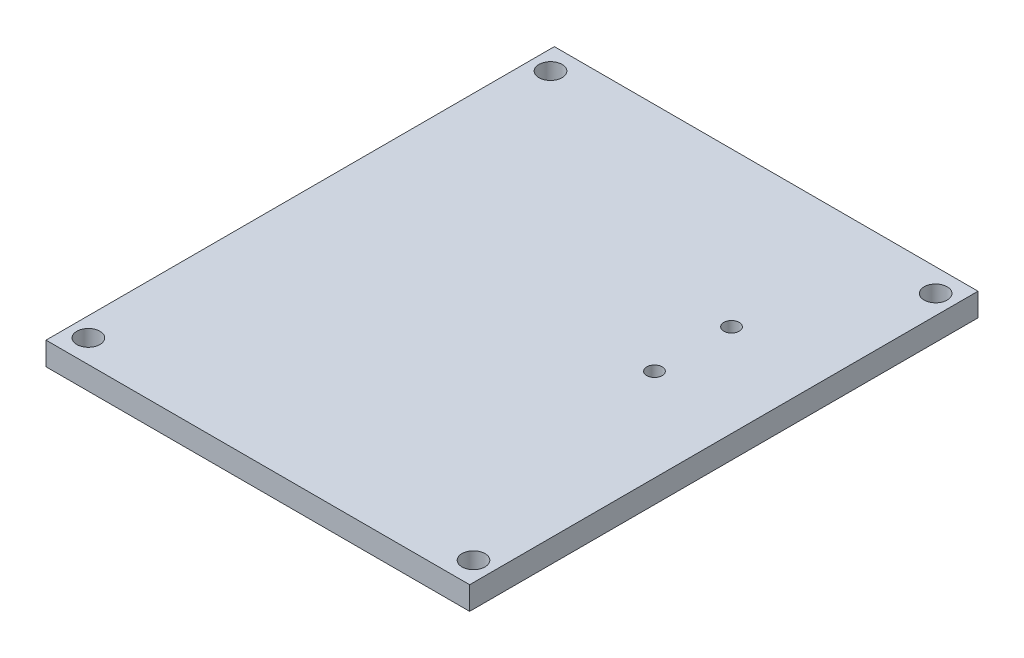
ISO-10303-21;
HEADER;
FILE_DESCRIPTION(('STEP AP214'),'2;1');
FILE_NAME('part.step','',(''),(''),'','','');
FILE_SCHEMA(('AUTOMOTIVE_DESIGN { 1 0 10303 214 1 1 1 1 }'));
ENDSEC;
DATA;
#1=APPLICATION_CONTEXT('core data for automotive mechanical design processes');
#2=APPLICATION_PROTOCOL_DEFINITION('international standard','automotive_design',2000,#1);
#3=PRODUCT_CONTEXT('',#1,'mechanical');
#4=PRODUCT('Part','Part','',(#3));
#5=PRODUCT_RELATED_PRODUCT_CATEGORY('part','',(#4));
#6=PRODUCT_DEFINITION_FORMATION('','',#4);
#7=PRODUCT_DEFINITION_CONTEXT('part definition',#1,'design');
#8=PRODUCT_DEFINITION('design','',#6,#7);
#9=PRODUCT_DEFINITION_SHAPE('','',#8);
#10=(LENGTH_UNIT() NAMED_UNIT(*) SI_UNIT(.MILLI.,.METRE.));
#11=(NAMED_UNIT(*) PLANE_ANGLE_UNIT() SI_UNIT($,.RADIAN.));
#12=(NAMED_UNIT(*) SI_UNIT($,.STERADIAN.) SOLID_ANGLE_UNIT());
#13=UNCERTAINTY_MEASURE_WITH_UNIT(LENGTH_MEASURE(1.E-05),#10,'distance_accuracy_value','');
#14=(GEOMETRIC_REPRESENTATION_CONTEXT(3) GLOBAL_UNCERTAINTY_ASSIGNED_CONTEXT((#13)) GLOBAL_UNIT_ASSIGNED_CONTEXT((#10,
#11,#12)) REPRESENTATION_CONTEXT('',''));
#15=CARTESIAN_POINT('',(0.,0.,0.));
#16=DIRECTION('',(0.,0.,1.));
#17=DIRECTION('',(1.,0.,0.));
#18=AXIS2_PLACEMENT_3D('',#15,#16,#17);
#19=CARTESIAN_POINT('',(0.,3.,0.));
#20=DIRECTION('',(0.,-1.,0.));
#21=DIRECTION('',(0.,0.,-1.));
#22=AXIS2_PLACEMENT_3D('',#19,#20,#21);
#23=PLANE('',#22);
#24=DIRECTION('',(0.,0.,-1.));
#25=VECTOR('',#24,1.);
#26=CARTESIAN_POINT('',(27.4604429562899,3.,33.0827471868763));
#27=LINE('',#26,#25);
#28=CARTESIAN_POINT('',(27.4604429562899,3.,33.0827471868763));
#29=VERTEX_POINT('',#28);
#30=CARTESIAN_POINT('',(27.4604429562899,3.,-32.9172528131237));
#31=VERTEX_POINT('',#30);
#32=EDGE_CURVE('E85',#29,#31,#27,.T.);
#33=ORIENTED_EDGE('',*,*,#32,.T.);
#34=DIRECTION('',(-1.,0.,0.));
#35=VECTOR('',#34,1.);
#36=CARTESIAN_POINT('',(-27.5395570437101,3.,-32.9172528131237));
#37=LINE('',#36,#35);
#38=CARTESIAN_POINT('',(-27.5395570437101,3.,-32.9172528131237));
#39=VERTEX_POINT('',#38);
#40=EDGE_CURVE('E80',#31,#39,#37,.T.);
#41=ORIENTED_EDGE('',*,*,#40,.T.);
#42=DIRECTION('',(0.,0.,1.));
#43=VECTOR('',#42,1.);
#44=CARTESIAN_POINT('',(-27.5395570437101,3.,33.0827471868763));
#45=LINE('',#44,#43);
#46=CARTESIAN_POINT('',(-27.5395570437101,3.,33.0827471868763));
#47=VERTEX_POINT('',#46);
#48=EDGE_CURVE('E83',#39,#47,#45,.T.);
#49=ORIENTED_EDGE('',*,*,#48,.T.);
#50=DIRECTION('',(1.,0.,0.));
#51=VECTOR('',#50,1.);
#52=CARTESIAN_POINT('',(-27.5395570437101,3.,33.0827471868763));
#53=LINE('',#52,#51);
#54=EDGE_CURVE('E50',#47,#29,#53,.T.);
#55=ORIENTED_EDGE('',*,*,#54,.T.);
#56=EDGE_LOOP('',(#33,#41,#49,#55));
#57=FACE_BOUND('',#56,.T.);
#58=CARTESIAN_POINT('',(-25.0395570437101,3.,-29.9172528131237));
#59=DIRECTION('',(0.,1.,0.));
#60=DIRECTION('',(0.,0.,1.));
#61=AXIS2_PLACEMENT_3D('',#58,#59,#60);
#62=CIRCLE('',#61,1.5);
#63=CARTESIAN_POINT('',(-25.0395570437101,3.,-28.4172528131237));
#64=VERTEX_POINT('',#63);
#65=EDGE_CURVE('E100',#64,#64,#62,.T.);
#66=ORIENTED_EDGE('',*,*,#65,.F.);
#67=EDGE_LOOP('',(#66));
#68=FACE_BOUND('',#67,.T.);
#69=CARTESIAN_POINT('',(24.9604429562899,3.,-29.9172528131237));
#70=DIRECTION('',(0.,1.,0.));
#71=DIRECTION('',(0.,0.,1.));
#72=AXIS2_PLACEMENT_3D('',#69,#70,#71);
#73=CIRCLE('',#72,1.5);
#74=CARTESIAN_POINT('',(24.9604429562899,3.,-28.4172528131237));
#75=VERTEX_POINT('',#74);
#76=EDGE_CURVE('E115',#75,#75,#73,.T.);
#77=ORIENTED_EDGE('',*,*,#76,.F.);
#78=EDGE_LOOP('',(#77));
#79=FACE_BOUND('',#78,.T.);
#80=CARTESIAN_POINT('',(24.9604429562899,3.,30.0827471868763));
#81=DIRECTION('',(0.,1.,0.));
#82=DIRECTION('',(0.,0.,1.));
#83=AXIS2_PLACEMENT_3D('',#80,#81,#82);
#84=CIRCLE('',#83,1.5);
#85=CARTESIAN_POINT('',(24.9604429562899,3.,31.5827471868763));
#86=VERTEX_POINT('',#85);
#87=EDGE_CURVE('E121',#86,#86,#84,.T.);
#88=ORIENTED_EDGE('',*,*,#87,.F.);
#89=EDGE_LOOP('',(#88));
#90=FACE_BOUND('',#89,.T.);
#91=CARTESIAN_POINT('',(-25.0395570437101,3.,30.0827471868763));
#92=DIRECTION('',(0.,1.,0.));
#93=DIRECTION('',(0.,0.,1.));
#94=AXIS2_PLACEMENT_3D('',#91,#92,#93);
#95=CIRCLE('',#94,1.5);
#96=CARTESIAN_POINT('',(-25.0395570437101,3.,31.5827471868763));
#97=VERTEX_POINT('',#96);
#98=EDGE_CURVE('E127',#97,#97,#95,.T.);
#99=ORIENTED_EDGE('',*,*,#98,.F.);
#100=EDGE_LOOP('',(#99));
#101=FACE_BOUND('',#100,.T.);
#102=CARTESIAN_POINT('',(15.4604429562899,3.,-12.9172528131237));
#103=DIRECTION('',(0.,1.,0.));
#104=DIRECTION('',(0.,0.,1.));
#105=AXIS2_PLACEMENT_3D('',#102,#103,#104);
#106=CIRCLE('',#105,1.00000000000001);
#107=CARTESIAN_POINT('',(15.4604429562899,3.,-11.9172528131237));
#108=VERTEX_POINT('',#107);
#109=EDGE_CURVE('E133',#108,#108,#106,.T.);
#110=ORIENTED_EDGE('',*,*,#109,.F.);
#111=EDGE_LOOP('',(#110));
#112=FACE_BOUND('',#111,.T.);
#113=CARTESIAN_POINT('',(15.4604429562899,3.,-2.91725281312371));
#114=DIRECTION('',(0.,1.,0.));
#115=DIRECTION('',(0.,0.,1.));
#116=AXIS2_PLACEMENT_3D('',#113,#114,#115);
#117=CIRCLE('',#116,1.);
#118=CARTESIAN_POINT('',(15.4604429562899,3.,-1.9172528131237));
#119=VERTEX_POINT('',#118);
#120=EDGE_CURVE('E139',#119,#119,#117,.T.);
#121=ORIENTED_EDGE('',*,*,#120,.F.);
#122=EDGE_LOOP('',(#121));
#123=FACE_BOUND('',#122,.T.);
#124=ADVANCED_FACE('F33',(#57,#68,#79,#90,#101,#112,#123),#23,.F.);
#125=CARTESIAN_POINT('',(0.,0.,0.));
#126=DIRECTION('',(0.,-1.,0.));
#127=DIRECTION('',(0.,0.,-1.));
#128=AXIS2_PLACEMENT_3D('',#125,#126,#127);
#129=PLANE('',#128);
#130=CARTESIAN_POINT('',(15.4604429562899,0.,-12.9172528131237));
#131=DIRECTION('',(0.,1.,0.));
#132=DIRECTION('',(0.,0.,1.));
#133=AXIS2_PLACEMENT_3D('',#130,#131,#132);
#134=CIRCLE('',#133,1.00000000000001);
#135=CARTESIAN_POINT('',(15.4604429562899,0.,-11.9172528131237));
#136=VERTEX_POINT('',#135);
#137=EDGE_CURVE('E136',#136,#136,#134,.T.);
#138=ORIENTED_EDGE('',*,*,#137,.T.);
#139=EDGE_LOOP('',(#138));
#140=FACE_BOUND('',#139,.T.);
#141=CARTESIAN_POINT('',(24.9604429562899,0.,30.0827471868763));
#142=DIRECTION('',(0.,1.,0.));
#143=DIRECTION('',(0.,0.,1.));
#144=AXIS2_PLACEMENT_3D('',#141,#142,#143);
#145=CIRCLE('',#144,1.5);
#146=CARTESIAN_POINT('',(24.9604429562899,0.,31.5827471868763));
#147=VERTEX_POINT('',#146);
#148=EDGE_CURVE('E124',#147,#147,#145,.T.);
#149=ORIENTED_EDGE('',*,*,#148,.T.);
#150=EDGE_LOOP('',(#149));
#151=FACE_BOUND('',#150,.T.);
#152=CARTESIAN_POINT('',(-25.0395570437101,0.,-29.9172528131237));
#153=DIRECTION('',(0.,1.,0.));
#154=DIRECTION('',(0.,0.,1.));
#155=AXIS2_PLACEMENT_3D('',#152,#153,#154);
#156=CIRCLE('',#155,1.5);
#157=CARTESIAN_POINT('',(-25.0395570437101,0.,-28.4172528131237));
#158=VERTEX_POINT('',#157);
#159=EDGE_CURVE('E112',#158,#158,#156,.T.);
#160=ORIENTED_EDGE('',*,*,#159,.T.);
#161=EDGE_LOOP('',(#160));
#162=FACE_BOUND('',#161,.T.);
#163=DIRECTION('',(0.,0.,-1.));
#164=VECTOR('',#163,1.);
#165=CARTESIAN_POINT('',(27.4604429562899,0.,33.0827471868763));
#166=LINE('',#165,#164);
#167=CARTESIAN_POINT('',(27.4604429562899,0.,33.0827471868763));
#168=VERTEX_POINT('',#167);
#169=CARTESIAN_POINT('',(27.4604429562899,0.,-32.9172528131237));
#170=VERTEX_POINT('',#169);
#171=EDGE_CURVE('E97',#168,#170,#166,.T.);
#172=ORIENTED_EDGE('',*,*,#171,.F.);
#173=DIRECTION('',(1.,0.,0.));
#174=VECTOR('',#173,1.);
#175=CARTESIAN_POINT('',(-27.5395570437101,0.,33.0827471868763));
#176=LINE('',#175,#174);
#177=CARTESIAN_POINT('',(-27.5395570437101,0.,33.0827471868763));
#178=VERTEX_POINT('',#177);
#179=EDGE_CURVE('E73',#178,#168,#176,.T.);
#180=ORIENTED_EDGE('',*,*,#179,.F.);
#181=DIRECTION('',(0.,0.,1.));
#182=VECTOR('',#181,1.);
#183=CARTESIAN_POINT('',(-27.5395570437101,0.,33.0827471868763));
#184=LINE('',#183,#182);
#185=CARTESIAN_POINT('',(-27.5395570437101,0.,-32.9172528131237));
#186=VERTEX_POINT('',#185);
#187=EDGE_CURVE('E67',#186,#178,#184,.T.);
#188=ORIENTED_EDGE('',*,*,#187,.F.);
#189=DIRECTION('',(-1.,0.,0.));
#190=VECTOR('',#189,1.);
#191=CARTESIAN_POINT('',(-27.5395570437101,0.,-32.9172528131237));
#192=LINE('',#191,#190);
#193=EDGE_CURVE('E89',#170,#186,#192,.T.);
#194=ORIENTED_EDGE('',*,*,#193,.F.);
#195=EDGE_LOOP('',(#172,#180,#188,#194));
#196=FACE_BOUND('',#195,.T.);
#197=CARTESIAN_POINT('',(24.9604429562899,0.,-29.9172528131237));
#198=DIRECTION('',(0.,1.,0.));
#199=DIRECTION('',(0.,0.,1.));
#200=AXIS2_PLACEMENT_3D('',#197,#198,#199);
#201=CIRCLE('',#200,1.5);
#202=CARTESIAN_POINT('',(24.9604429562899,0.,-28.4172528131237));
#203=VERTEX_POINT('',#202);
#204=EDGE_CURVE('E118',#203,#203,#201,.T.);
#205=ORIENTED_EDGE('',*,*,#204,.T.);
#206=EDGE_LOOP('',(#205));
#207=FACE_BOUND('',#206,.T.);
#208=CARTESIAN_POINT('',(-25.0395570437101,0.,30.0827471868763));
#209=DIRECTION('',(0.,1.,0.));
#210=DIRECTION('',(0.,0.,1.));
#211=AXIS2_PLACEMENT_3D('',#208,#209,#210);
#212=CIRCLE('',#211,1.5);
#213=CARTESIAN_POINT('',(-25.0395570437101,0.,31.5827471868763));
#214=VERTEX_POINT('',#213);
#215=EDGE_CURVE('E130',#214,#214,#212,.T.);
#216=ORIENTED_EDGE('',*,*,#215,.T.);
#217=EDGE_LOOP('',(#216));
#218=FACE_BOUND('',#217,.T.);
#219=CARTESIAN_POINT('',(15.4604429562899,0.,-2.91725281312371));
#220=DIRECTION('',(0.,1.,0.));
#221=DIRECTION('',(0.,0.,1.));
#222=AXIS2_PLACEMENT_3D('',#219,#220,#221);
#223=CIRCLE('',#222,1.);
#224=CARTESIAN_POINT('',(15.4604429562899,0.,-1.9172528131237));
#225=VERTEX_POINT('',#224);
#226=EDGE_CURVE('E142',#225,#225,#223,.T.);
#227=ORIENTED_EDGE('',*,*,#226,.T.);
#228=EDGE_LOOP('',(#227));
#229=FACE_BOUND('',#228,.T.);
#230=ADVANCED_FACE('F108',(#140,#151,#162,#196,#207,#218,#229),#129,.T.);
#231=CARTESIAN_POINT('',(27.4604429562899,3.,33.0827471868763));
#232=DIRECTION('',(-1.,0.,0.));
#233=DIRECTION('',(0.,0.,1.));
#234=AXIS2_PLACEMENT_3D('',#231,#232,#233);
#235=PLANE('',#234);
#236=ORIENTED_EDGE('',*,*,#171,.T.);
#237=DIRECTION('',(0.,-1.,0.));
#238=VECTOR('',#237,1.);
#239=CARTESIAN_POINT('',(27.4604429562899,3.,-32.9172528131237));
#240=LINE('',#239,#238);
#241=EDGE_CURVE('E11',#31,#170,#240,.T.);
#242=ORIENTED_EDGE('',*,*,#241,.F.);
#243=ORIENTED_EDGE('',*,*,#32,.F.);
#244=DIRECTION('',(0.,-1.,0.));
#245=VECTOR('',#244,1.);
#246=CARTESIAN_POINT('',(27.4604429562899,3.,33.0827471868763));
#247=LINE('',#246,#245);
#248=EDGE_CURVE('E93',#29,#168,#247,.T.);
#249=ORIENTED_EDGE('',*,*,#248,.T.);
#250=EDGE_LOOP('',(#236,#242,#243,#249));
#251=FACE_BOUND('',#250,.T.);
#252=ADVANCED_FACE('F35',(#251),#235,.F.);
#253=CARTESIAN_POINT('',(-27.5395570437101,3.,-32.9172528131237));
#254=DIRECTION('',(0.,0.,1.));
#255=DIRECTION('',(1.,0.,0.));
#256=AXIS2_PLACEMENT_3D('',#253,#254,#255);
#257=PLANE('',#256);
#258=ORIENTED_EDGE('',*,*,#193,.T.);
#259=DIRECTION('',(0.,-1.,0.));
#260=VECTOR('',#259,1.);
#261=CARTESIAN_POINT('',(-27.5395570437101,3.,-32.9172528131237));
#262=LINE('',#261,#260);
#263=EDGE_CURVE('E42',#39,#186,#262,.T.);
#264=ORIENTED_EDGE('',*,*,#263,.F.);
#265=ORIENTED_EDGE('',*,*,#40,.F.);
#266=ORIENTED_EDGE('',*,*,#241,.T.);
#267=EDGE_LOOP('',(#258,#264,#265,#266));
#268=FACE_BOUND('',#267,.T.);
#269=ADVANCED_FACE('F88',(#268),#257,.F.);
#270=CARTESIAN_POINT('',(-27.5395570437101,3.,33.0827471868763));
#271=DIRECTION('',(1.,0.,0.));
#272=DIRECTION('',(0.,0.,-1.));
#273=AXIS2_PLACEMENT_3D('',#270,#271,#272);
#274=PLANE('',#273);
#275=ORIENTED_EDGE('',*,*,#187,.T.);
#276=DIRECTION('',(0.,-1.,0.));
#277=VECTOR('',#276,1.);
#278=CARTESIAN_POINT('',(-27.5395570437101,3.,33.0827471868763));
#279=LINE('',#278,#277);
#280=EDGE_CURVE('E90',#47,#178,#279,.T.);
#281=ORIENTED_EDGE('',*,*,#280,.F.);
#282=ORIENTED_EDGE('',*,*,#48,.F.);
#283=ORIENTED_EDGE('',*,*,#263,.T.);
#284=EDGE_LOOP('',(#275,#281,#282,#283));
#285=FACE_BOUND('',#284,.T.);
#286=ADVANCED_FACE('F91',(#285),#274,.F.);
#287=CARTESIAN_POINT('',(-27.5395570437101,3.,33.0827471868763));
#288=DIRECTION('',(0.,0.,-1.));
#289=DIRECTION('',(-1.,0.,0.));
#290=AXIS2_PLACEMENT_3D('',#287,#288,#289);
#291=PLANE('',#290);
#292=ORIENTED_EDGE('',*,*,#179,.T.);
#293=ORIENTED_EDGE('',*,*,#248,.F.);
#294=ORIENTED_EDGE('',*,*,#54,.F.);
#295=ORIENTED_EDGE('',*,*,#280,.T.);
#296=EDGE_LOOP('',(#292,#293,#294,#295));
#297=FACE_BOUND('',#296,.T.);
#298=ADVANCED_FACE('F105',(#297),#291,.F.);
#299=CARTESIAN_POINT('',(-25.0395570437101,3.,-29.9172528131237));
#300=DIRECTION('',(0.,-1.,0.));
#301=DIRECTION('',(0.,0.,-1.));
#302=AXIS2_PLACEMENT_3D('',#299,#300,#301);
#303=CYLINDRICAL_SURFACE('',#302,1.5);
#304=ORIENTED_EDGE('',*,*,#65,.T.);
#305=EDGE_LOOP('',(#304));
#306=FACE_BOUND('',#305,.T.);
#307=ORIENTED_EDGE('',*,*,#159,.F.);
#308=EDGE_LOOP('',(#307));
#309=FACE_BOUND('',#308,.T.);
#310=ADVANCED_FACE('F159',(#306,#309),#303,.F.);
#311=CARTESIAN_POINT('',(24.9604429562899,3.,-29.9172528131237));
#312=DIRECTION('',(0.,-1.,0.));
#313=DIRECTION('',(0.,0.,-1.));
#314=AXIS2_PLACEMENT_3D('',#311,#312,#313);
#315=CYLINDRICAL_SURFACE('',#314,1.5);
#316=ORIENTED_EDGE('',*,*,#76,.T.);
#317=EDGE_LOOP('',(#316));
#318=FACE_BOUND('',#317,.T.);
#319=ORIENTED_EDGE('',*,*,#204,.F.);
#320=EDGE_LOOP('',(#319));
#321=FACE_BOUND('',#320,.T.);
#322=ADVANCED_FACE('F205',(#318,#321),#315,.F.);
#323=CARTESIAN_POINT('',(24.9604429562899,3.,30.0827471868763));
#324=DIRECTION('',(0.,-1.,0.));
#325=DIRECTION('',(0.,0.,-1.));
#326=AXIS2_PLACEMENT_3D('',#323,#324,#325);
#327=CYLINDRICAL_SURFACE('',#326,1.5);
#328=ORIENTED_EDGE('',*,*,#87,.T.);
#329=EDGE_LOOP('',(#328));
#330=FACE_BOUND('',#329,.T.);
#331=ORIENTED_EDGE('',*,*,#148,.F.);
#332=EDGE_LOOP('',(#331));
#333=FACE_BOUND('',#332,.T.);
#334=ADVANCED_FACE('F213',(#330,#333),#327,.F.);
#335=CARTESIAN_POINT('',(-25.0395570437101,3.,30.0827471868763));
#336=DIRECTION('',(0.,-1.,0.));
#337=DIRECTION('',(0.,0.,-1.));
#338=AXIS2_PLACEMENT_3D('',#335,#336,#337);
#339=CYLINDRICAL_SURFACE('',#338,1.5);
#340=ORIENTED_EDGE('',*,*,#98,.T.);
#341=EDGE_LOOP('',(#340));
#342=FACE_BOUND('',#341,.T.);
#343=ORIENTED_EDGE('',*,*,#215,.F.);
#344=EDGE_LOOP('',(#343));
#345=FACE_BOUND('',#344,.T.);
#346=ADVANCED_FACE('F221',(#342,#345),#339,.F.);
#347=CARTESIAN_POINT('',(15.4604429562899,3.,-12.9172528131237));
#348=DIRECTION('',(0.,-1.,0.));
#349=DIRECTION('',(0.,0.,-1.));
#350=AXIS2_PLACEMENT_3D('',#347,#348,#349);
#351=CYLINDRICAL_SURFACE('',#350,1.00000000000001);
#352=ORIENTED_EDGE('',*,*,#109,.T.);
#353=EDGE_LOOP('',(#352));
#354=FACE_BOUND('',#353,.T.);
#355=ORIENTED_EDGE('',*,*,#137,.F.);
#356=EDGE_LOOP('',(#355));
#357=FACE_BOUND('',#356,.T.);
#358=ADVANCED_FACE('F230',(#354,#357),#351,.F.);
#359=CARTESIAN_POINT('',(15.4604429562899,3.,-2.91725281312371));
#360=DIRECTION('',(0.,-1.,0.));
#361=DIRECTION('',(0.,0.,-1.));
#362=AXIS2_PLACEMENT_3D('',#359,#360,#361);
#363=CYLINDRICAL_SURFACE('',#362,1.);
#364=ORIENTED_EDGE('',*,*,#120,.T.);
#365=EDGE_LOOP('',(#364));
#366=FACE_BOUND('',#365,.T.);
#367=ORIENTED_EDGE('',*,*,#226,.F.);
#368=EDGE_LOOP('',(#367));
#369=FACE_BOUND('',#368,.T.);
#370=ADVANCED_FACE('F148',(#366,#369),#363,.F.);
#371=CLOSED_SHELL('',(#124,#230,#252,#269,#286,#298,#310,#322,#334,#346,#358,#370));
#372=MANIFOLD_SOLID_BREP('B2',#371);
#373=ADVANCED_BREP_SHAPE_REPRESENTATION('',(#18,#372),#14);
#374=SHAPE_DEFINITION_REPRESENTATION(#9,#373);
ENDSEC;
END-ISO-10303-21;
